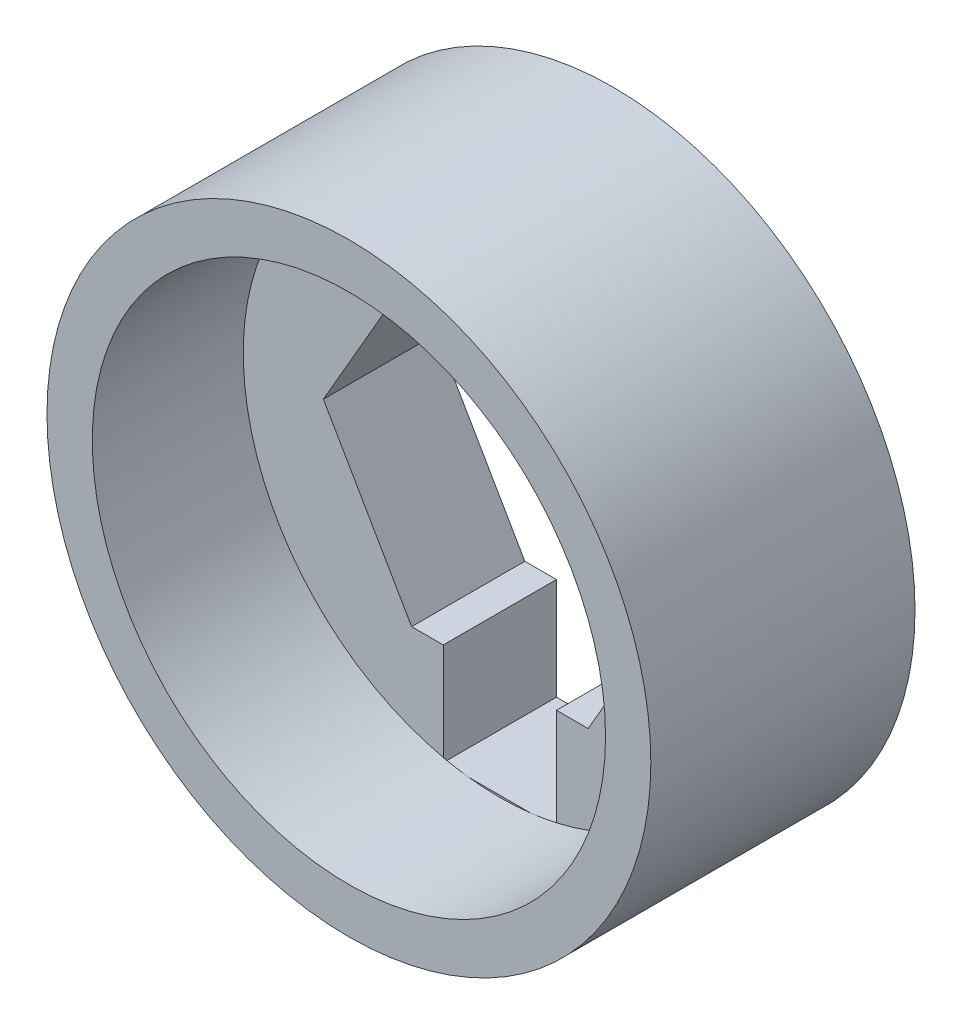
ISO-10303-21;
HEADER;
FILE_DESCRIPTION(('STEP AP214'),'2;1');
FILE_NAME('part.step','',(''),(''),'','','');
FILE_SCHEMA(('AUTOMOTIVE_DESIGN { 1 0 10303 214 1 1 1 1 }'));
ENDSEC;
DATA;
#1=APPLICATION_CONTEXT('core data for automotive mechanical design processes');
#2=APPLICATION_PROTOCOL_DEFINITION('international standard','automotive_design',2000,#1);
#3=PRODUCT_CONTEXT('',#1,'mechanical');
#4=PRODUCT('Part','Part','',(#3));
#5=PRODUCT_RELATED_PRODUCT_CATEGORY('part','',(#4));
#6=PRODUCT_DEFINITION_FORMATION('','',#4);
#7=PRODUCT_DEFINITION_CONTEXT('part definition',#1,'design');
#8=PRODUCT_DEFINITION('design','',#6,#7);
#9=PRODUCT_DEFINITION_SHAPE('','',#8);
#10=(LENGTH_UNIT() NAMED_UNIT(*) SI_UNIT(.MILLI.,.METRE.));
#11=(NAMED_UNIT(*) PLANE_ANGLE_UNIT() SI_UNIT($,.RADIAN.));
#12=(NAMED_UNIT(*) SI_UNIT($,.STERADIAN.) SOLID_ANGLE_UNIT());
#13=UNCERTAINTY_MEASURE_WITH_UNIT(LENGTH_MEASURE(1.E-05),#10,'distance_accuracy_value','');
#14=(GEOMETRIC_REPRESENTATION_CONTEXT(3) GLOBAL_UNCERTAINTY_ASSIGNED_CONTEXT((#13)) GLOBAL_UNIT_ASSIGNED_CONTEXT((#10,
#11,#12)) REPRESENTATION_CONTEXT('',''));
#15=CARTESIAN_POINT('',(0.,0.,0.));
#16=DIRECTION('',(0.,0.,1.));
#17=DIRECTION('',(1.,0.,0.));
#18=AXIS2_PLACEMENT_3D('',#15,#16,#17);
#19=CARTESIAN_POINT('',(0.,0.,3.));
#20=DIRECTION('',(0.,0.,1.));
#21=DIRECTION('',(1.,0.,0.));
#22=AXIS2_PLACEMENT_3D('',#19,#20,#21);
#23=PLANE('',#22);
#24=DIRECTION('',(0.,-1.,0.));
#25=VECTOR('',#24,1.);
#26=CARTESIAN_POINT('',(-1.5,6.75,3.));
#27=LINE('',#26,#25);
#28=CARTESIAN_POINT('',(-1.5,6.63249575951617,3.));
#29=VERTEX_POINT('',#28);
#30=CARTESIAN_POINT('',(-1.5,4.05,3.));
#31=VERTEX_POINT('',#30);
#32=EDGE_CURVE('E202',#29,#31,#27,.T.);
#33=ORIENTED_EDGE('',*,*,#32,.F.);
#34=CARTESIAN_POINT('',(0.,0.,3.));
#35=DIRECTION('',(0.,0.,1.));
#36=DIRECTION('',(1.,0.,0.));
#37=AXIS2_PLACEMENT_3D('',#34,#35,#36);
#38=CIRCLE('',#37,6.79999999999999);
#39=CARTESIAN_POINT('',(-1.5,-6.63249575951617,3.));
#40=VERTEX_POINT('',#39);
#41=EDGE_CURVE('E363',#29,#40,#38,.T.);
#42=ORIENTED_EDGE('',*,*,#41,.T.);
#43=DIRECTION('',(0.,-1.,0.));
#44=VECTOR('',#43,1.);
#45=CARTESIAN_POINT('',(-1.5,-3.75,3.));
#46=LINE('',#45,#44);
#47=CARTESIAN_POINT('',(-1.5,-4.05,3.));
#48=VERTEX_POINT('',#47);
#49=EDGE_CURVE('E230',#48,#40,#46,.T.);
#50=ORIENTED_EDGE('',*,*,#49,.F.);
#51=DIRECTION('',(-1.,0.,0.));
#52=VECTOR('',#51,1.);
#53=CARTESIAN_POINT('',(0.,-4.05,3.));
#54=LINE('',#53,#52);
#55=CARTESIAN_POINT('',(-2.33826859021798,-4.05,3.));
#56=VERTEX_POINT('',#55);
#57=EDGE_CURVE('E311',#48,#56,#54,.T.);
#58=ORIENTED_EDGE('',*,*,#57,.T.);
#59=DIRECTION('',(-0.5,0.866025403784439,0.));
#60=VECTOR('',#59,1.);
#61=CARTESIAN_POINT('',(-3.50740288532698,-2.025,3.));
#62=LINE('',#61,#60);
#63=CARTESIAN_POINT('',(-4.67653718043597,0.,3.));
#64=VERTEX_POINT('',#63);
#65=EDGE_CURVE('E319',#56,#64,#62,.T.);
#66=ORIENTED_EDGE('',*,*,#65,.T.);
#67=DIRECTION('',(0.5,0.866025403784439,0.));
#68=VECTOR('',#67,1.);
#69=CARTESIAN_POINT('',(-3.50740288532698,2.025,3.));
#70=LINE('',#69,#68);
#71=CARTESIAN_POINT('',(-2.33826859021798,4.05,3.));
#72=VERTEX_POINT('',#71);
#73=EDGE_CURVE('E323',#64,#72,#70,.T.);
#74=ORIENTED_EDGE('',*,*,#73,.T.);
#75=DIRECTION('',(1.,0.,0.));
#76=VECTOR('',#75,1.);
#77=CARTESIAN_POINT('',(0.,4.05,3.));
#78=LINE('',#77,#76);
#79=EDGE_CURVE('E328',#72,#31,#78,.T.);
#80=ORIENTED_EDGE('',*,*,#79,.T.);
#81=EDGE_LOOP('',(#33,#42,#50,#58,#66,#74,#80));
#82=FACE_BOUND('',#81,.T.);
#83=ADVANCED_FACE('F41',(#82),#23,.T.);
#84=DIRECTION('',(-1.,0.,0.));
#85=VECTOR('',#84,1.);
#86=CARTESIAN_POINT('',(-1.5,6.75,3.));
#87=LINE('',#86,#85);
#88=CARTESIAN_POINT('',(0.823103881657654,6.75,3.));
#89=VERTEX_POINT('',#88);
#90=CARTESIAN_POINT('',(-0.823103881657658,6.75,3.));
#91=VERTEX_POINT('',#90);
#92=EDGE_CURVE('E208',#89,#91,#87,.T.);
#93=ORIENTED_EDGE('',*,*,#92,.F.);
#94=EDGE_CURVE('E302',#89,#91,#38,.T.);
#95=ORIENTED_EDGE('',*,*,#94,.T.);
#96=EDGE_LOOP('',(#93,#95));
#97=FACE_BOUND('',#96,.T.);
#98=ADVANCED_FACE('F410',(#97),#23,.T.);
#99=DIRECTION('',(0.,1.,0.));
#100=VECTOR('',#99,1.);
#101=CARTESIAN_POINT('',(1.5,6.75,3.));
#102=LINE('',#101,#100);
#103=CARTESIAN_POINT('',(1.5,4.05,3.));
#104=VERTEX_POINT('',#103);
#105=CARTESIAN_POINT('',(1.5,6.63249575951616,3.));
#106=VERTEX_POINT('',#105);
#107=EDGE_CURVE('E205',#104,#106,#102,.T.);
#108=ORIENTED_EDGE('',*,*,#107,.F.);
#109=CARTESIAN_POINT('',(2.33826859021798,4.05,3.));
#110=VERTEX_POINT('',#109);
#111=EDGE_CURVE('E327',#104,#110,#78,.T.);
#112=ORIENTED_EDGE('',*,*,#111,.T.);
#113=DIRECTION('',(0.5,-0.866025403784439,0.));
#114=VECTOR('',#113,1.);
#115=CARTESIAN_POINT('',(3.50740288532698,2.025,3.));
#116=LINE('',#115,#114);
#117=CARTESIAN_POINT('',(4.67653718043597,0.,3.));
#118=VERTEX_POINT('',#117);
#119=EDGE_CURVE('E332',#110,#118,#116,.T.);
#120=ORIENTED_EDGE('',*,*,#119,.T.);
#121=DIRECTION('',(-0.5,-0.866025403784439,0.));
#122=VECTOR('',#121,1.);
#123=CARTESIAN_POINT('',(3.50740288532698,-2.025,3.));
#124=LINE('',#123,#122);
#125=CARTESIAN_POINT('',(2.33826859021798,-4.05,3.));
#126=VERTEX_POINT('',#125);
#127=EDGE_CURVE('E336',#118,#126,#124,.T.);
#128=ORIENTED_EDGE('',*,*,#127,.T.);
#129=CARTESIAN_POINT('',(1.5,-4.05,3.));
#130=VERTEX_POINT('',#129);
#131=EDGE_CURVE('E315',#126,#130,#54,.T.);
#132=ORIENTED_EDGE('',*,*,#131,.T.);
#133=DIRECTION('',(0.,1.,0.));
#134=VECTOR('',#133,1.);
#135=CARTESIAN_POINT('',(1.5,-3.75,3.));
#136=LINE('',#135,#134);
#137=CARTESIAN_POINT('',(1.5,-6.63249575951616,3.));
#138=VERTEX_POINT('',#137);
#139=EDGE_CURVE('E65',#138,#130,#136,.T.);
#140=ORIENTED_EDGE('',*,*,#139,.F.);
#141=EDGE_CURVE('E303',#138,#106,#38,.T.);
#142=ORIENTED_EDGE('',*,*,#141,.T.);
#143=EDGE_LOOP('',(#108,#112,#120,#128,#132,#140,#142));
#144=FACE_BOUND('',#143,.T.);
#145=ADVANCED_FACE('F351',(#144),#23,.T.);
#146=CARTESIAN_POINT('',(2.33826859021798,4.05,4.));
#147=DIRECTION('',(0.,-1.,0.));
#148=DIRECTION('',(0.,0.,-1.));
#149=AXIS2_PLACEMENT_3D('',#146,#147,#148);
#150=PLANE('',#149);
#151=DIRECTION('',(0.,0.,-1.));
#152=VECTOR('',#151,1.);
#153=CARTESIAN_POINT('',(-1.5,4.05,4.));
#154=LINE('',#153,#152);
#155=CARTESIAN_POINT('',(-1.5,4.05,0.));
#156=VERTEX_POINT('',#155);
#157=EDGE_CURVE('E11',#31,#156,#154,.T.);
#158=ORIENTED_EDGE('',*,*,#157,.F.);
#159=ORIENTED_EDGE('',*,*,#79,.F.);
#160=DIRECTION('',(0.,0.,-1.));
#161=VECTOR('',#160,1.);
#162=CARTESIAN_POINT('',(-2.33826859021798,4.05,4.));
#163=LINE('',#162,#161);
#164=CARTESIAN_POINT('',(-2.33826859021798,4.05,0.));
#165=VERTEX_POINT('',#164);
#166=EDGE_CURVE('E287',#72,#165,#163,.T.);
#167=ORIENTED_EDGE('',*,*,#166,.T.);
#168=DIRECTION('',(-1.,0.,0.));
#169=VECTOR('',#168,1.);
#170=CARTESIAN_POINT('',(2.33826859021798,4.05,0.));
#171=LINE('',#170,#169);
#172=EDGE_CURVE('E261',#156,#165,#171,.T.);
#173=ORIENTED_EDGE('',*,*,#172,.F.);
#174=EDGE_LOOP('',(#158,#159,#167,#173));
#175=FACE_BOUND('',#174,.T.);
#176=ADVANCED_FACE('F417',(#175),#150,.T.);
#177=CARTESIAN_POINT('',(-2.33826859021798,-4.05,4.));
#178=DIRECTION('',(0.,1.,0.));
#179=DIRECTION('',(0.,0.,1.));
#180=AXIS2_PLACEMENT_3D('',#177,#178,#179);
#181=PLANE('',#180);
#182=DIRECTION('',(0.,0.,1.));
#183=VECTOR('',#182,1.);
#184=CARTESIAN_POINT('',(-1.5,-4.05,4.));
#185=LINE('',#184,#183);
#186=CARTESIAN_POINT('',(-1.5,-4.05,0.));
#187=VERTEX_POINT('',#186);
#188=EDGE_CURVE('E343',#187,#48,#185,.T.);
#189=ORIENTED_EDGE('',*,*,#188,.F.);
#190=DIRECTION('',(1.,0.,0.));
#191=VECTOR('',#190,1.);
#192=CARTESIAN_POINT('',(-2.33826859021798,-4.05,0.));
#193=LINE('',#192,#191);
#194=CARTESIAN_POINT('',(-2.33826859021798,-4.05,0.));
#195=VERTEX_POINT('',#194);
#196=EDGE_CURVE('E273',#195,#187,#193,.T.);
#197=ORIENTED_EDGE('',*,*,#196,.F.);
#198=DIRECTION('',(0.,0.,-1.));
#199=VECTOR('',#198,1.);
#200=CARTESIAN_POINT('',(-2.33826859021798,-4.05,4.));
#201=LINE('',#200,#199);
#202=EDGE_CURVE('E281',#56,#195,#201,.T.);
#203=ORIENTED_EDGE('',*,*,#202,.F.);
#204=ORIENTED_EDGE('',*,*,#57,.F.);
#205=EDGE_LOOP('',(#189,#197,#203,#204));
#206=FACE_BOUND('',#205,.T.);
#207=ADVANCED_FACE('F429',(#206),#181,.T.);
#208=CARTESIAN_POINT('',(0.,0.,0.));
#209=DIRECTION('',(0.,0.,1.));
#210=DIRECTION('',(1.,0.,0.));
#211=AXIS2_PLACEMENT_3D('',#208,#209,#210);
#212=PLANE('',#211);
#213=DIRECTION('',(-1.,0.,0.));
#214=VECTOR('',#213,1.);
#215=CARTESIAN_POINT('',(-1.5,6.75,0.));
#216=LINE('',#215,#214);
#217=CARTESIAN_POINT('',(1.5,6.75,0.));
#218=VERTEX_POINT('',#217);
#219=CARTESIAN_POINT('',(-1.5,6.75,0.));
#220=VERTEX_POINT('',#219);
#221=EDGE_CURVE('E175',#218,#220,#216,.T.);
#222=ORIENTED_EDGE('',*,*,#221,.T.);
#223=DIRECTION('',(0.,-1.,0.));
#224=VECTOR('',#223,1.);
#225=CARTESIAN_POINT('',(-1.5,6.75,0.));
#226=LINE('',#225,#224);
#227=EDGE_CURVE('E192',#220,#156,#226,.T.);
#228=ORIENTED_EDGE('',*,*,#227,.T.);
#229=ORIENTED_EDGE('',*,*,#172,.T.);
#230=DIRECTION('',(-0.5,-0.866025403784439,0.));
#231=VECTOR('',#230,1.);
#232=CARTESIAN_POINT('',(-2.33826859021798,4.05,0.));
#233=LINE('',#232,#231);
#234=CARTESIAN_POINT('',(-4.67653718043597,0.,0.));
#235=VERTEX_POINT('',#234);
#236=EDGE_CURVE('E264',#165,#235,#233,.T.);
#237=ORIENTED_EDGE('',*,*,#236,.T.);
#238=DIRECTION('',(0.5,-0.866025403784438,0.));
#239=VECTOR('',#238,1.);
#240=CARTESIAN_POINT('',(-4.67653718043597,0.,0.));
#241=LINE('',#240,#239);
#242=EDGE_CURVE('E268',#235,#195,#241,.T.);
#243=ORIENTED_EDGE('',*,*,#242,.T.);
#244=ORIENTED_EDGE('',*,*,#196,.T.);
#245=DIRECTION('',(0.,-1.,0.));
#246=VECTOR('',#245,1.);
#247=CARTESIAN_POINT('',(-1.5,-3.75,0.));
#248=LINE('',#247,#246);
#249=CARTESIAN_POINT('',(-1.5,-6.75,0.));
#250=VERTEX_POINT('',#249);
#251=EDGE_CURVE('E213',#187,#250,#248,.T.);
#252=ORIENTED_EDGE('',*,*,#251,.T.);
#253=DIRECTION('',(1.,0.,0.));
#254=VECTOR('',#253,1.);
#255=CARTESIAN_POINT('',(-1.5,-6.75,0.));
#256=LINE('',#255,#254);
#257=CARTESIAN_POINT('',(1.5,-6.75,0.));
#258=VERTEX_POINT('',#257);
#259=EDGE_CURVE('E217',#250,#258,#256,.T.);
#260=ORIENTED_EDGE('',*,*,#259,.T.);
#261=DIRECTION('',(0.,1.,0.));
#262=VECTOR('',#261,1.);
#263=CARTESIAN_POINT('',(1.5,-3.75,0.));
#264=LINE('',#263,#262);
#265=CARTESIAN_POINT('',(1.5,-4.05,0.));
#266=VERTEX_POINT('',#265);
#267=EDGE_CURVE('E222',#258,#266,#264,.T.);
#268=ORIENTED_EDGE('',*,*,#267,.T.);
#269=CARTESIAN_POINT('',(2.33826859021798,-4.05,0.));
#270=VERTEX_POINT('',#269);
#271=EDGE_CURVE('E272',#266,#270,#193,.T.);
#272=ORIENTED_EDGE('',*,*,#271,.T.);
#273=DIRECTION('',(0.5,0.866025403784439,0.));
#274=VECTOR('',#273,1.);
#275=CARTESIAN_POINT('',(2.33826859021798,-4.05,0.));
#276=LINE('',#275,#274);
#277=CARTESIAN_POINT('',(4.67653718043597,0.,0.));
#278=VERTEX_POINT('',#277);
#279=EDGE_CURVE('E254',#270,#278,#276,.T.);
#280=ORIENTED_EDGE('',*,*,#279,.T.);
#281=DIRECTION('',(-0.5,0.866025403784438,0.));
#282=VECTOR('',#281,1.);
#283=CARTESIAN_POINT('',(4.67653718043597,0.,0.));
#284=LINE('',#283,#282);
#285=CARTESIAN_POINT('',(2.33826859021798,4.05,0.));
#286=VERTEX_POINT('',#285);
#287=EDGE_CURVE('E258',#278,#286,#284,.T.);
#288=ORIENTED_EDGE('',*,*,#287,.T.);
#289=CARTESIAN_POINT('',(1.5,4.05,0.));
#290=VERTEX_POINT('',#289);
#291=EDGE_CURVE('E190',#286,#290,#171,.T.);
#292=ORIENTED_EDGE('',*,*,#291,.T.);
#293=DIRECTION('',(0.,1.,0.));
#294=VECTOR('',#293,1.);
#295=CARTESIAN_POINT('',(1.5,6.75,0.));
#296=LINE('',#295,#294);
#297=EDGE_CURVE('E57',#290,#218,#296,.T.);
#298=ORIENTED_EDGE('',*,*,#297,.T.);
#299=EDGE_LOOP('',(#222,#228,#229,#237,#243,#244,#252,#260,#268,#272,#280,#288,#292,#298));
#300=FACE_BOUND('',#299,.T.);
#301=CARTESIAN_POINT('',(0.,0.,0.));
#302=DIRECTION('',(0.,0.,1.));
#303=DIRECTION('',(1.,0.,0.));
#304=AXIS2_PLACEMENT_3D('',#301,#302,#303);
#305=CIRCLE('',#304,7.99999999999999);
#306=CARTESIAN_POINT('',(-7.99999999999999,0.,0.));
#307=VERTEX_POINT('',#306);
#308=EDGE_CURVE('E301',#307,#307,#305,.T.);
#309=ORIENTED_EDGE('',*,*,#308,.F.);
#310=EDGE_LOOP('',(#309));
#311=FACE_BOUND('',#310,.T.);
#312=ADVANCED_FACE('F186',(#300,#311),#212,.F.);
#313=DIRECTION('',(1.,0.,0.));
#314=VECTOR('',#313,1.);
#315=CARTESIAN_POINT('',(-1.5,-6.75,3.));
#316=LINE('',#315,#314);
#317=CARTESIAN_POINT('',(-0.823103881657654,-6.75,3.));
#318=VERTEX_POINT('',#317);
#319=CARTESIAN_POINT('',(0.823103881657658,-6.75,3.));
#320=VERTEX_POINT('',#319);
#321=EDGE_CURVE('E235',#318,#320,#316,.T.);
#322=ORIENTED_EDGE('',*,*,#321,.F.);
#323=EDGE_CURVE('E366',#318,#320,#38,.T.);
#324=ORIENTED_EDGE('',*,*,#323,.T.);
#325=EDGE_LOOP('',(#322,#324));
#326=FACE_BOUND('',#325,.T.);
#327=ADVANCED_FACE('F381',(#326),#23,.T.);
#328=CARTESIAN_POINT('',(0.,0.,7.));
#329=DIRECTION('',(0.,0.,-1.));
#330=DIRECTION('',(-1.,0.,0.));
#331=AXIS2_PLACEMENT_3D('',#328,#329,#330);
#332=CYLINDRICAL_SURFACE('',#331,7.99999999999999);
#333=CARTESIAN_POINT('',(0.,0.,7.));
#334=DIRECTION('',(0.,0.,1.));
#335=DIRECTION('',(1.,0.,0.));
#336=AXIS2_PLACEMENT_3D('',#333,#334,#335);
#337=CIRCLE('',#336,7.99999999999999);
#338=CARTESIAN_POINT('',(-7.99999999999999,0.,7.));
#339=VERTEX_POINT('',#338);
#340=EDGE_CURVE('E307',#339,#339,#337,.T.);
#341=CARTESIAN_POINT('',(-7.99999999999999,0.,7.));
#342=CARTESIAN_POINT('',(-7.99999999999999,0.,6.92708333333333));
#343=CARTESIAN_POINT('',(-7.99999999999999,0.,6.85416666666667));
#344=CARTESIAN_POINT('',(-7.99999999999999,0.,6.70833333333333));
#345=CARTESIAN_POINT('',(-7.99999999999999,0.,6.63541666666667));
#346=CARTESIAN_POINT('',(-7.99999999999999,0.,6.48958333333333));
#347=CARTESIAN_POINT('',(-7.99999999999999,0.,6.41666666666667));
#348=CARTESIAN_POINT('',(-7.99999999999999,0.,6.27083333333333));
#349=CARTESIAN_POINT('',(-7.99999999999999,0.,6.19791666666667));
#350=CARTESIAN_POINT('',(-7.99999999999999,0.,6.05208333333333));
#351=CARTESIAN_POINT('',(-7.99999999999999,0.,5.97916666666667));
#352=CARTESIAN_POINT('',(-7.99999999999999,0.,5.83333333333333));
#353=CARTESIAN_POINT('',(-7.99999999999999,0.,5.76041666666667));
#354=CARTESIAN_POINT('',(-7.99999999999999,0.,5.61458333333333));
#355=CARTESIAN_POINT('',(-7.99999999999999,0.,5.54166666666667));
#356=CARTESIAN_POINT('',(-7.99999999999999,0.,5.39583333333333));
#357=CARTESIAN_POINT('',(-7.99999999999999,0.,5.32291666666667));
#358=CARTESIAN_POINT('',(-7.99999999999999,0.,5.17708333333333));
#359=CARTESIAN_POINT('',(-7.99999999999999,0.,5.10416666666667));
#360=CARTESIAN_POINT('',(-7.99999999999999,0.,4.95833333333333));
#361=CARTESIAN_POINT('',(-7.99999999999999,0.,4.88541666666667));
#362=CARTESIAN_POINT('',(-7.99999999999999,0.,4.73958333333333));
#363=CARTESIAN_POINT('',(-7.99999999999999,0.,4.66666666666667));
#364=CARTESIAN_POINT('',(-7.99999999999999,0.,4.52083333333333));
#365=CARTESIAN_POINT('',(-7.99999999999999,0.,4.44791666666667));
#366=CARTESIAN_POINT('',(-7.99999999999999,0.,4.30208333333333));
#367=CARTESIAN_POINT('',(-7.99999999999999,0.,4.22916666666667));
#368=CARTESIAN_POINT('',(-7.99999999999999,0.,4.08333333333333));
#369=CARTESIAN_POINT('',(-7.99999999999999,0.,4.01041666666667));
#370=CARTESIAN_POINT('',(-7.99999999999999,0.,3.86458333333333));
#371=CARTESIAN_POINT('',(-7.99999999999999,0.,3.79166666666667));
#372=CARTESIAN_POINT('',(-7.99999999999999,0.,3.64583333333333));
#373=CARTESIAN_POINT('',(-7.99999999999999,0.,3.57291666666667));
#374=CARTESIAN_POINT('',(-7.99999999999999,0.,3.42708333333333));
#375=CARTESIAN_POINT('',(-7.99999999999999,0.,3.35416666666667));
#376=CARTESIAN_POINT('',(-7.99999999999999,0.,3.20833333333333));
#377=CARTESIAN_POINT('',(-7.99999999999999,0.,3.13541666666667));
#378=CARTESIAN_POINT('',(-7.99999999999999,0.,2.98958333333333));
#379=CARTESIAN_POINT('',(-7.99999999999999,0.,2.91666666666667));
#380=CARTESIAN_POINT('',(-7.99999999999999,0.,2.77083333333333));
#381=CARTESIAN_POINT('',(-7.99999999999999,0.,2.69791666666667));
#382=CARTESIAN_POINT('',(-7.99999999999999,0.,2.55208333333333));
#383=CARTESIAN_POINT('',(-7.99999999999999,0.,2.47916666666667));
#384=CARTESIAN_POINT('',(-7.99999999999999,0.,2.33333333333333));
#385=CARTESIAN_POINT('',(-7.99999999999999,0.,2.26041666666667));
#386=CARTESIAN_POINT('',(-7.99999999999999,0.,2.11458333333333));
#387=CARTESIAN_POINT('',(-7.99999999999999,0.,2.04166666666667));
#388=CARTESIAN_POINT('',(-7.99999999999999,0.,1.89583333333333));
#389=CARTESIAN_POINT('',(-7.99999999999999,0.,1.82291666666667));
#390=CARTESIAN_POINT('',(-7.99999999999999,0.,1.67708333333333));
#391=CARTESIAN_POINT('',(-7.99999999999999,0.,1.60416666666667));
#392=CARTESIAN_POINT('',(-7.99999999999999,0.,1.45833333333333));
#393=CARTESIAN_POINT('',(-7.99999999999999,0.,1.38541666666667));
#394=CARTESIAN_POINT('',(-7.99999999999999,0.,1.23958333333333));
#395=CARTESIAN_POINT('',(-7.99999999999999,0.,1.16666666666667));
#396=CARTESIAN_POINT('',(-7.99999999999999,0.,1.02083333333333));
#397=CARTESIAN_POINT('',(-7.99999999999999,0.,0.947916666666666));
#398=CARTESIAN_POINT('',(-7.99999999999999,0.,0.802083333333332));
#399=CARTESIAN_POINT('',(-7.99999999999999,0.,0.729166666666666));
#400=CARTESIAN_POINT('',(-7.99999999999999,0.,0.583333333333332));
#401=CARTESIAN_POINT('',(-7.99999999999999,0.,0.510416666666666));
#402=CARTESIAN_POINT('',(-7.99999999999999,0.,0.364583333333333));
#403=CARTESIAN_POINT('',(-7.99999999999999,0.,0.291666666666666));
#404=CARTESIAN_POINT('',(-7.99999999999999,0.,0.145833333333333));
#405=CARTESIAN_POINT('',(-7.99999999999999,0.,0.0729166666666657));
#406=CARTESIAN_POINT('',(-7.99999999999999,0.,0.));
#407=B_SPLINE_CURVE_WITH_KNOTS('',3,(#341,#342,#343,#344,#345,#346,#347,#348,#349,#350,#351,
#352,#353,#354,#355,#356,#357,#358,#359,#360,#361,#362,#363,#364,#365,#366,#367,#368,#369,#370,
#371,#372,#373,#374,#375,#376,#377,#378,#379,#380,#381,#382,#383,#384,#385,#386,#387,#388,#389,
#390,#391,#392,#393,#394,#395,#396,#397,#398,#399,#400,#401,#402,#403,#404,#405,#406),
.UNSPECIFIED.,.F.,.F.,(4,2,2,2,2,2,2,2,2,2,2,2,2,2,2,2,2,2,2,2,2,2,2,2,2,2,2,2,2,2,2,2,4),(0.,
0.218749999999999,0.4375,0.65625,0.875,1.09375,1.3125,1.53125,1.75,1.96875,2.1875,2.40625,2.625,
2.84375,3.0625,3.28125,3.5,3.71875,3.9375,4.15625,4.375,4.59375,4.8125,5.03125,5.25,5.46875,
5.6875,5.90625,6.125,6.34375,6.5625,6.78125,7.),.UNSPECIFIED.);
#408=EDGE_CURVE('BSEAM43',#339,#307,#407,.T.);
#409=ORIENTED_EDGE('',*,*,#340,.F.);
#410=ORIENTED_EDGE('',*,*,#308,.T.);
#411=ORIENTED_EDGE('',*,*,#408,.T.);
#412=ORIENTED_EDGE('',*,*,#408,.F.);
#413=EDGE_LOOP('',(#409,#411,#410,#412));
#414=FACE_BOUND('',#413,.T.);
#415=ADVANCED_FACE('F43',(#414),#332,.T.);
#416=CARTESIAN_POINT('',(0.,0.,7.));
#417=DIRECTION('',(0.,0.,1.));
#418=DIRECTION('',(1.,0.,0.));
#419=AXIS2_PLACEMENT_3D('',#416,#417,#418);
#420=PLANE('',#419);
#421=CARTESIAN_POINT('',(0.,0.,7.));
#422=DIRECTION('',(0.,0.,1.));
#423=DIRECTION('',(1.,0.,0.));
#424=AXIS2_PLACEMENT_3D('',#421,#422,#423);
#425=CIRCLE('',#424,6.79999999999999);
#426=CARTESIAN_POINT('',(6.79999999999999,0.,7.));
#427=VERTEX_POINT('',#426);
#428=EDGE_CURVE('E297',#427,#427,#425,.T.);
#429=ORIENTED_EDGE('',*,*,#428,.F.);
#430=EDGE_LOOP('',(#429));
#431=FACE_BOUND('',#430,.T.);
#432=ORIENTED_EDGE('',*,*,#340,.T.);
#433=EDGE_LOOP('',(#432));
#434=FACE_BOUND('',#433,.T.);
#435=ADVANCED_FACE('F425',(#431,#434),#420,.T.);
#436=CARTESIAN_POINT('',(0.,0.,3.));
#437=DIRECTION('',(0.,0.,1.));
#438=DIRECTION('',(1.,0.,0.));
#439=AXIS2_PLACEMENT_3D('',#436,#437,#438);
#440=CYLINDRICAL_SURFACE('',#439,6.79999999999999);
#441=EDGE_CURVE('E298',#106,#89,#38,.T.);
#442=ORIENTED_EDGE('',*,*,#441,.F.);
#443=ORIENTED_EDGE('',*,*,#141,.F.);
#444=CARTESIAN_POINT('',(0.,0.,3.));
#445=DIRECTION('',(0.,0.,1.));
#446=DIRECTION('',(1.,0.,0.));
#447=AXIS2_PLACEMENT_3D('',#444,#445,#446);
#448=CIRCLE('',#447,6.79999999999999);
#449=EDGE_CURVE('E249',#138,#320,#448,.F.);
#450=ORIENTED_EDGE('',*,*,#449,.T.);
#451=ORIENTED_EDGE('',*,*,#323,.F.);
#452=EDGE_CURVE('E211',#318,#40,#448,.F.);
#453=ORIENTED_EDGE('',*,*,#452,.T.);
#454=ORIENTED_EDGE('',*,*,#41,.F.);
#455=CARTESIAN_POINT('',(0.,0.,3.));
#456=DIRECTION('',(0.,0.,1.));
#457=DIRECTION('',(1.,0.,0.));
#458=AXIS2_PLACEMENT_3D('',#455,#456,#457);
#459=CIRCLE('',#458,6.79999999999999);
#460=EDGE_CURVE('E250',#29,#91,#459,.F.);
#461=ORIENTED_EDGE('',*,*,#460,.T.);
#462=ORIENTED_EDGE('',*,*,#94,.F.);
#463=EDGE_LOOP('',(#442,#443,#450,#451,#453,#454,#461,#462));
#464=FACE_BOUND('',#463,.T.);
#465=ORIENTED_EDGE('',*,*,#428,.T.);
#466=EDGE_LOOP('',(#465));
#467=FACE_BOUND('',#466,.T.);
#468=ADVANCED_FACE('F375',(#464,#467),#440,.F.);
#469=CARTESIAN_POINT('',(2.33826859021798,-4.05,4.));
#470=DIRECTION('',(-0.866025403784439,0.5,0.));
#471=DIRECTION('',(-0.5,-0.866025403784439,0.));
#472=AXIS2_PLACEMENT_3D('',#469,#470,#471);
#473=PLANE('',#472);
#474=DIRECTION('',(0.,0.,-1.));
#475=VECTOR('',#474,1.);
#476=CARTESIAN_POINT('',(4.67653718043597,0.,4.));
#477=LINE('',#476,#475);
#478=EDGE_CURVE('E294',#118,#278,#477,.T.);
#479=ORIENTED_EDGE('',*,*,#478,.T.);
#480=ORIENTED_EDGE('',*,*,#279,.F.);
#481=DIRECTION('',(0.,0.,-1.));
#482=VECTOR('',#481,1.);
#483=CARTESIAN_POINT('',(2.33826859021798,-4.05,4.));
#484=LINE('',#483,#482);
#485=EDGE_CURVE('E277',#126,#270,#484,.T.);
#486=ORIENTED_EDGE('',*,*,#485,.F.);
#487=ORIENTED_EDGE('',*,*,#127,.F.);
#488=EDGE_LOOP('',(#479,#480,#486,#487));
#489=FACE_BOUND('',#488,.T.);
#490=ADVANCED_FACE('F421',(#489),#473,.T.);
#491=CARTESIAN_POINT('',(4.67653718043597,0.,4.));
#492=DIRECTION('',(-0.866025403784438,-0.5,0.));
#493=DIRECTION('',(0.5,-0.866025403784439,0.));
#494=AXIS2_PLACEMENT_3D('',#491,#492,#493);
#495=PLANE('',#494);
#496=DIRECTION('',(0.,0.,-1.));
#497=VECTOR('',#496,1.);
#498=CARTESIAN_POINT('',(2.33826859021798,4.05,4.));
#499=LINE('',#498,#497);
#500=EDGE_CURVE('E291',#110,#286,#499,.T.);
#501=ORIENTED_EDGE('',*,*,#500,.T.);
#502=ORIENTED_EDGE('',*,*,#287,.F.);
#503=ORIENTED_EDGE('',*,*,#478,.F.);
#504=ORIENTED_EDGE('',*,*,#119,.F.);
#505=EDGE_LOOP('',(#501,#502,#503,#504));
#506=FACE_BOUND('',#505,.T.);
#507=ADVANCED_FACE('F463',(#506),#495,.T.);
#508=DIRECTION('',(0.,0.,1.));
#509=VECTOR('',#508,1.);
#510=CARTESIAN_POINT('',(1.5,4.05,4.));
#511=LINE('',#510,#509);
#512=EDGE_CURVE('E50',#290,#104,#511,.T.);
#513=ORIENTED_EDGE('',*,*,#512,.F.);
#514=ORIENTED_EDGE('',*,*,#291,.F.);
#515=ORIENTED_EDGE('',*,*,#500,.F.);
#516=ORIENTED_EDGE('',*,*,#111,.F.);
#517=EDGE_LOOP('',(#513,#514,#515,#516));
#518=FACE_BOUND('',#517,.T.);
#519=ADVANCED_FACE('F357',(#518),#150,.T.);
#520=CARTESIAN_POINT('',(-2.33826859021798,4.05,4.));
#521=DIRECTION('',(0.866025403784439,-0.5,0.));
#522=DIRECTION('',(0.5,0.866025403784439,0.));
#523=AXIS2_PLACEMENT_3D('',#520,#521,#522);
#524=PLANE('',#523);
#525=DIRECTION('',(0.,0.,-1.));
#526=VECTOR('',#525,1.);
#527=CARTESIAN_POINT('',(-4.67653718043597,0.,4.));
#528=LINE('',#527,#526);
#529=EDGE_CURVE('E284',#64,#235,#528,.T.);
#530=ORIENTED_EDGE('',*,*,#529,.T.);
#531=ORIENTED_EDGE('',*,*,#236,.F.);
#532=ORIENTED_EDGE('',*,*,#166,.F.);
#533=ORIENTED_EDGE('',*,*,#73,.F.);
#534=EDGE_LOOP('',(#530,#531,#532,#533));
#535=FACE_BOUND('',#534,.T.);
#536=ADVANCED_FACE('F453',(#535),#524,.T.);
#537=CARTESIAN_POINT('',(-4.67653718043597,0.,4.));
#538=DIRECTION('',(0.866025403784438,0.5,0.));
#539=DIRECTION('',(-0.5,0.866025403784439,0.));
#540=AXIS2_PLACEMENT_3D('',#537,#538,#539);
#541=PLANE('',#540);
#542=ORIENTED_EDGE('',*,*,#202,.T.);
#543=ORIENTED_EDGE('',*,*,#242,.F.);
#544=ORIENTED_EDGE('',*,*,#529,.F.);
#545=ORIENTED_EDGE('',*,*,#65,.F.);
#546=EDGE_LOOP('',(#542,#543,#544,#545));
#547=FACE_BOUND('',#546,.T.);
#548=ADVANCED_FACE('F445',(#547),#541,.T.);
#549=DIRECTION('',(0.,0.,-1.));
#550=VECTOR('',#549,1.);
#551=CARTESIAN_POINT('',(1.5,-4.05,4.));
#552=LINE('',#551,#550);
#553=EDGE_CURVE('E340',#130,#266,#552,.T.);
#554=ORIENTED_EDGE('',*,*,#553,.F.);
#555=ORIENTED_EDGE('',*,*,#131,.F.);
#556=ORIENTED_EDGE('',*,*,#485,.T.);
#557=ORIENTED_EDGE('',*,*,#271,.F.);
#558=EDGE_LOOP('',(#554,#555,#556,#557));
#559=FACE_BOUND('',#558,.T.);
#560=ADVANCED_FACE('F435',(#559),#181,.T.);
#561=CARTESIAN_POINT('',(0.,0.,3.));
#562=DIRECTION('',(0.,0.,1.));
#563=DIRECTION('',(1.,0.,0.));
#564=AXIS2_PLACEMENT_3D('',#561,#562,#563);
#565=PLANE('',#564);
#566=CARTESIAN_POINT('',(1.5,-6.75,3.));
#567=VERTEX_POINT('',#566);
#568=EDGE_CURVE('E218',#567,#138,#136,.T.);
#569=ORIENTED_EDGE('',*,*,#568,.F.);
#570=EDGE_CURVE('E236',#320,#567,#316,.T.);
#571=ORIENTED_EDGE('',*,*,#570,.F.);
#572=ORIENTED_EDGE('',*,*,#449,.F.);
#573=EDGE_LOOP('',(#569,#571,#572));
#574=FACE_BOUND('',#573,.T.);
#575=ADVANCED_FACE('F444',(#574),#565,.F.);
#576=CARTESIAN_POINT('',(-1.5,-6.75,3.));
#577=VERTEX_POINT('',#576);
#578=EDGE_CURVE('E231',#577,#318,#316,.T.);
#579=ORIENTED_EDGE('',*,*,#578,.F.);
#580=EDGE_CURVE('E227',#40,#577,#46,.T.);
#581=ORIENTED_EDGE('',*,*,#580,.F.);
#582=ORIENTED_EDGE('',*,*,#452,.F.);
#583=EDGE_LOOP('',(#579,#581,#582));
#584=FACE_BOUND('',#583,.T.);
#585=ADVANCED_FACE('F451',(#584),#565,.F.);
#586=CARTESIAN_POINT('',(-1.5,-3.75,0.));
#587=DIRECTION('',(-1.,0.,0.));
#588=DIRECTION('',(0.,-1.,0.));
#589=AXIS2_PLACEMENT_3D('',#586,#587,#588);
#590=PLANE('',#589);
#591=ORIENTED_EDGE('',*,*,#188,.T.);
#592=ORIENTED_EDGE('',*,*,#49,.T.);
#593=ORIENTED_EDGE('',*,*,#580,.T.);
#594=DIRECTION('',(0.,0.,1.));
#595=VECTOR('',#594,1.);
#596=CARTESIAN_POINT('',(-1.5,-6.75,0.));
#597=LINE('',#596,#595);
#598=EDGE_CURVE('E226',#250,#577,#597,.T.);
#599=ORIENTED_EDGE('',*,*,#598,.F.);
#600=ORIENTED_EDGE('',*,*,#251,.F.);
#601=EDGE_LOOP('',(#591,#592,#593,#599,#600));
#602=FACE_BOUND('',#601,.T.);
#603=ADVANCED_FACE('F390',(#602),#590,.F.);
#604=CARTESIAN_POINT('',(1.5,-3.75,0.));
#605=DIRECTION('',(1.,0.,0.));
#606=DIRECTION('',(0.,1.,0.));
#607=AXIS2_PLACEMENT_3D('',#604,#605,#606);
#608=PLANE('',#607);
#609=ORIENTED_EDGE('',*,*,#553,.T.);
#610=ORIENTED_EDGE('',*,*,#267,.F.);
#611=DIRECTION('',(0.,0.,1.));
#612=VECTOR('',#611,1.);
#613=CARTESIAN_POINT('',(1.5,-6.75,0.));
#614=LINE('',#613,#612);
#615=EDGE_CURVE('E239',#258,#567,#614,.T.);
#616=ORIENTED_EDGE('',*,*,#615,.T.);
#617=ORIENTED_EDGE('',*,*,#568,.T.);
#618=ORIENTED_EDGE('',*,*,#139,.T.);
#619=EDGE_LOOP('',(#609,#610,#616,#617,#618));
#620=FACE_BOUND('',#619,.T.);
#621=ADVANCED_FACE('F465',(#620),#608,.F.);
#622=CARTESIAN_POINT('',(-1.5,-6.75,0.));
#623=DIRECTION('',(0.,-1.,0.));
#624=DIRECTION('',(1.,0.,0.));
#625=AXIS2_PLACEMENT_3D('',#622,#623,#624);
#626=PLANE('',#625);
#627=ORIENTED_EDGE('',*,*,#578,.T.);
#628=ORIENTED_EDGE('',*,*,#321,.T.);
#629=ORIENTED_EDGE('',*,*,#570,.T.);
#630=ORIENTED_EDGE('',*,*,#615,.F.);
#631=ORIENTED_EDGE('',*,*,#259,.F.);
#632=ORIENTED_EDGE('',*,*,#598,.T.);
#633=EDGE_LOOP('',(#627,#628,#629,#630,#631,#632));
#634=FACE_BOUND('',#633,.T.);
#635=ADVANCED_FACE('F466',(#634),#626,.F.);
#636=CARTESIAN_POINT('',(0.,0.,3.));
#637=DIRECTION('',(0.,0.,1.));
#638=DIRECTION('',(1.,0.,0.));
#639=AXIS2_PLACEMENT_3D('',#636,#637,#638);
#640=PLANE('',#639);
#641=CARTESIAN_POINT('',(-1.5,6.75,3.));
#642=VERTEX_POINT('',#641);
#643=EDGE_CURVE('E198',#642,#29,#27,.T.);
#644=ORIENTED_EDGE('',*,*,#643,.F.);
#645=EDGE_CURVE('E209',#91,#642,#87,.T.);
#646=ORIENTED_EDGE('',*,*,#645,.F.);
#647=ORIENTED_EDGE('',*,*,#460,.F.);
#648=EDGE_LOOP('',(#644,#646,#647));
#649=FACE_BOUND('',#648,.T.);
#650=ADVANCED_FACE('F477',(#649),#640,.F.);
#651=CARTESIAN_POINT('',(1.5,6.75,3.));
#652=VERTEX_POINT('',#651);
#653=EDGE_CURVE('E195',#652,#89,#87,.T.);
#654=ORIENTED_EDGE('',*,*,#653,.F.);
#655=EDGE_CURVE('E169',#106,#652,#102,.T.);
#656=ORIENTED_EDGE('',*,*,#655,.F.);
#657=ORIENTED_EDGE('',*,*,#441,.T.);
#658=EDGE_LOOP('',(#654,#656,#657));
#659=FACE_BOUND('',#658,.T.);
#660=ADVANCED_FACE('F479',(#659),#640,.F.);
#661=CARTESIAN_POINT('',(-1.5,6.75,0.));
#662=DIRECTION('',(-1.,0.,0.));
#663=DIRECTION('',(0.,-1.,0.));
#664=AXIS2_PLACEMENT_3D('',#661,#662,#663);
#665=PLANE('',#664);
#666=ORIENTED_EDGE('',*,*,#157,.T.);
#667=ORIENTED_EDGE('',*,*,#227,.F.);
#668=DIRECTION('',(0.,0.,1.));
#669=VECTOR('',#668,1.);
#670=CARTESIAN_POINT('',(-1.5,6.75,0.));
#671=LINE('',#670,#669);
#672=EDGE_CURVE('E174',#220,#642,#671,.T.);
#673=ORIENTED_EDGE('',*,*,#672,.T.);
#674=ORIENTED_EDGE('',*,*,#643,.T.);
#675=ORIENTED_EDGE('',*,*,#32,.T.);
#676=EDGE_LOOP('',(#666,#667,#673,#674,#675));
#677=FACE_BOUND('',#676,.T.);
#678=ADVANCED_FACE('F476',(#677),#665,.F.);
#679=CARTESIAN_POINT('',(-1.5,6.75,0.));
#680=DIRECTION('',(0.,1.,0.));
#681=DIRECTION('',(-1.,0.,0.));
#682=AXIS2_PLACEMENT_3D('',#679,#680,#681);
#683=PLANE('',#682);
#684=ORIENTED_EDGE('',*,*,#653,.T.);
#685=ORIENTED_EDGE('',*,*,#92,.T.);
#686=ORIENTED_EDGE('',*,*,#645,.T.);
#687=ORIENTED_EDGE('',*,*,#672,.F.);
#688=ORIENTED_EDGE('',*,*,#221,.F.);
#689=DIRECTION('',(0.,0.,1.));
#690=VECTOR('',#689,1.);
#691=CARTESIAN_POINT('',(1.5,6.75,0.));
#692=LINE('',#691,#690);
#693=EDGE_CURVE('E165',#218,#652,#692,.T.);
#694=ORIENTED_EDGE('',*,*,#693,.T.);
#695=EDGE_LOOP('',(#684,#685,#686,#687,#688,#694));
#696=FACE_BOUND('',#695,.T.);
#697=ADVANCED_FACE('F178',(#696),#683,.F.);
#698=CARTESIAN_POINT('',(1.5,6.75,0.));
#699=DIRECTION('',(1.,0.,0.));
#700=DIRECTION('',(0.,1.,0.));
#701=AXIS2_PLACEMENT_3D('',#698,#699,#700);
#702=PLANE('',#701);
#703=ORIENTED_EDGE('',*,*,#512,.T.);
#704=ORIENTED_EDGE('',*,*,#107,.T.);
#705=ORIENTED_EDGE('',*,*,#655,.T.);
#706=ORIENTED_EDGE('',*,*,#693,.F.);
#707=ORIENTED_EDGE('',*,*,#297,.F.);
#708=EDGE_LOOP('',(#703,#704,#705,#706,#707));
#709=FACE_BOUND('',#708,.T.);
#710=ADVANCED_FACE('F167',(#709),#702,.F.);
#711=CLOSED_SHELL('',(#83,#98,#145,#176,#207,#312,#327,#415,#435,#468,#490,#507,#519,#536,#548,
#560,#575,#585,#603,#621,#635,#650,#660,#678,#697,#710));
#712=MANIFOLD_SOLID_BREP('B2',#711);
#713=ADVANCED_BREP_SHAPE_REPRESENTATION('',(#18,#712),#14);
#714=SHAPE_DEFINITION_REPRESENTATION(#9,#713);
ENDSEC;
END-ISO-10303-21;
